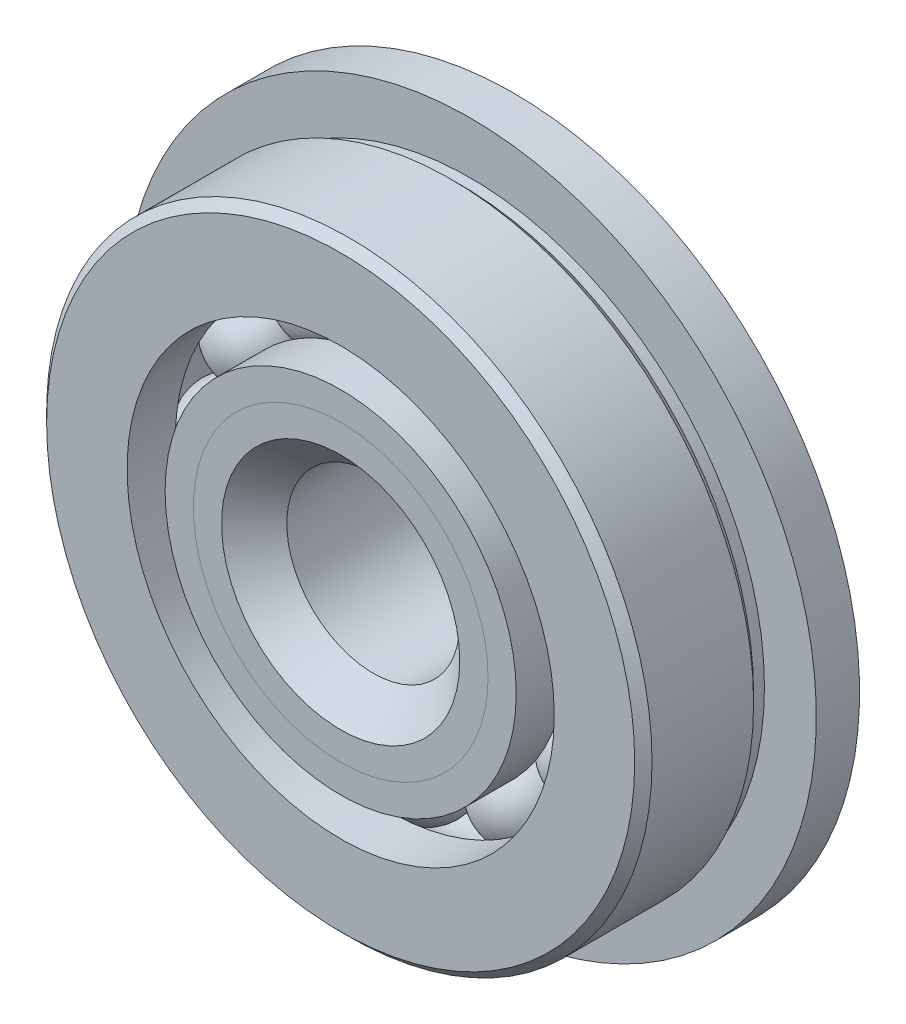
ISO-10303-21;
HEADER;
FILE_DESCRIPTION(('STEP AP214'),'2;1');
FILE_NAME('part.step','',(''),(''),'','','');
FILE_SCHEMA(('AUTOMOTIVE_DESIGN { 1 0 10303 214 1 1 1 1 }'));
ENDSEC;
DATA;
#1=APPLICATION_CONTEXT('core data for automotive mechanical design processes');
#2=APPLICATION_PROTOCOL_DEFINITION('international standard','automotive_design',2000,#1);
#3=PRODUCT_CONTEXT('',#1,'mechanical');
#4=PRODUCT('Part','Part','',(#3));
#5=PRODUCT_RELATED_PRODUCT_CATEGORY('part','',(#4));
#6=PRODUCT_DEFINITION_FORMATION('','',#4);
#7=PRODUCT_DEFINITION_CONTEXT('part definition',#1,'design');
#8=PRODUCT_DEFINITION('design','',#6,#7);
#9=PRODUCT_DEFINITION_SHAPE('','',#8);
#10=(LENGTH_UNIT() NAMED_UNIT(*) SI_UNIT(.MILLI.,.METRE.));
#11=(NAMED_UNIT(*) PLANE_ANGLE_UNIT() SI_UNIT($,.RADIAN.));
#12=(NAMED_UNIT(*) SI_UNIT($,.STERADIAN.) SOLID_ANGLE_UNIT());
#13=UNCERTAINTY_MEASURE_WITH_UNIT(LENGTH_MEASURE(1.E-05),#10,'distance_accuracy_value','');
#14=(GEOMETRIC_REPRESENTATION_CONTEXT(3) GLOBAL_UNCERTAINTY_ASSIGNED_CONTEXT((#13)) GLOBAL_UNIT_ASSIGNED_CONTEXT((#10,
#11,#12)) REPRESENTATION_CONTEXT('',''));
#15=CARTESIAN_POINT('',(0.,0.,0.));
#16=DIRECTION('',(0.,0.,1.));
#17=DIRECTION('',(1.,0.,0.));
#18=AXIS2_PLACEMENT_3D('',#15,#16,#17);
#19=CARTESIAN_POINT('',(-3.57187499999992,6.18666897828513,0.));
#20=DIRECTION('',(0.,0.,1.));
#21=DIRECTION('',(-0.499999999999989,0.866025403784445,0.));
#22=AXIS2_PLACEMENT_3D('',#19,#20,#21);
#23=SPHERICAL_SURFACE('',#22,1.57421805197336);
#24=CARTESIAN_POINT('',(-3.57187499999992,6.18666897828513,1.57421805197336));
#25=VERTEX_POINT('',#24);
#26=VERTEX_LOOP('',#25);
#27=FACE_BOUND('',#26,.T.);
#28=ADVANCED_FACE('F36',(#27),#23,.T.);
#29=CLOSED_SHELL('',(#28));
#30=MANIFOLD_SOLID_BREP('B2',#29);
#31=CARTESIAN_POINT('',(-6.18666897828504,3.57187500000007,0.));
#32=DIRECTION('',(0.,0.,1.));
#33=DIRECTION('',(-0.866025403784433,0.50000000000001,0.));
#34=AXIS2_PLACEMENT_3D('',#31,#32,#33);
#35=SPHERICAL_SURFACE('',#34,1.57421805197336);
#36=CARTESIAN_POINT('',(-6.18666897828504,3.57187500000007,1.57421805197336));
#37=VERTEX_POINT('',#36);
#38=VERTEX_LOOP('',#37);
#39=FACE_BOUND('',#38,.T.);
#40=ADVANCED_FACE('F65',(#39),#35,.T.);
#41=CLOSED_SHELL('',(#40));
#42=MANIFOLD_SOLID_BREP('B6',#41);
#43=CARTESIAN_POINT('',(-7.14375,0.,0.));
#44=DIRECTION('',(0.,0.,1.));
#45=DIRECTION('',(-1.,0.,0.));
#46=AXIS2_PLACEMENT_3D('',#43,#44,#45);
#47=SPHERICAL_SURFACE('',#46,1.57421805197336);
#48=CARTESIAN_POINT('',(-7.14375,0.,1.57421805197336));
#49=VERTEX_POINT('',#48);
#50=VERTEX_LOOP('',#49);
#51=FACE_BOUND('',#50,.T.);
#52=ADVANCED_FACE('F94',(#51),#47,.T.);
#53=CLOSED_SHELL('',(#52));
#54=MANIFOLD_SOLID_BREP('B32',#53);
#55=CARTESIAN_POINT('',(-6.18666897828512,-3.57187499999994,0.));
#56=DIRECTION('',(0.,0.,1.));
#57=DIRECTION('',(-0.866025403784443,-0.499999999999992,0.));
#58=AXIS2_PLACEMENT_3D('',#55,#56,#57);
#59=SPHERICAL_SURFACE('',#58,1.57421805197336);
#60=CARTESIAN_POINT('',(-6.18666897828512,-3.57187499999994,1.57421805197336));
#61=VERTEX_POINT('',#60);
#62=VERTEX_LOOP('',#61);
#63=FACE_BOUND('',#62,.T.);
#64=ADVANCED_FACE('F123',(#63),#59,.T.);
#65=CLOSED_SHELL('',(#64));
#66=MANIFOLD_SOLID_BREP('B61',#65);
#67=CARTESIAN_POINT('',(-3.57187500000005,-6.18666897828506,0.));
#68=DIRECTION('',(0.,0.,1.));
#69=DIRECTION('',(-0.500000000000007,-0.866025403784435,0.));
#70=AXIS2_PLACEMENT_3D('',#67,#68,#69);
#71=SPHERICAL_SURFACE('',#70,1.57421805197336);
#72=CARTESIAN_POINT('',(-3.57187500000005,-6.18666897828506,1.57421805197336));
#73=VERTEX_POINT('',#72);
#74=VERTEX_LOOP('',#73);
#75=FACE_BOUND('',#74,.T.);
#76=ADVANCED_FACE('F152',(#75),#71,.T.);
#77=CLOSED_SHELL('',(#76));
#78=MANIFOLD_SOLID_BREP('B90',#77);
#79=CARTESIAN_POINT('',(0.,-7.14375,0.));
#80=DIRECTION('',(0.,0.,1.));
#81=DIRECTION('',(0.,-1.,0.));
#82=AXIS2_PLACEMENT_3D('',#79,#80,#81);
#83=SPHERICAL_SURFACE('',#82,1.57421805197336);
#84=CARTESIAN_POINT('',(0.,-7.14375,1.57421805197336));
#85=VERTEX_POINT('',#84);
#86=VERTEX_LOOP('',#85);
#87=FACE_BOUND('',#86,.T.);
#88=ADVANCED_FACE('F181',(#87),#83,.T.);
#89=CLOSED_SHELL('',(#88));
#90=MANIFOLD_SOLID_BREP('B119',#89);
#91=CARTESIAN_POINT('',(3.57187499999996,-6.18666897828511,0.));
#92=DIRECTION('',(0.,0.,1.));
#93=DIRECTION('',(0.499999999999995,-0.866025403784442,0.));
#94=AXIS2_PLACEMENT_3D('',#91,#92,#93);
#95=SPHERICAL_SURFACE('',#94,1.57421805197336);
#96=CARTESIAN_POINT('',(3.57187499999996,-6.18666897828511,1.57421805197336));
#97=VERTEX_POINT('',#96);
#98=VERTEX_LOOP('',#97);
#99=FACE_BOUND('',#98,.T.);
#100=ADVANCED_FACE('F210',(#99),#95,.T.);
#101=CLOSED_SHELL('',(#100));
#102=MANIFOLD_SOLID_BREP('B148',#101);
#103=CARTESIAN_POINT('',(6.18666897828507,-3.57187500000003,0.));
#104=DIRECTION('',(0.,0.,1.));
#105=DIRECTION('',(0.866025403784436,-0.500000000000004,0.));
#106=AXIS2_PLACEMENT_3D('',#103,#104,#105);
#107=SPHERICAL_SURFACE('',#106,1.57421805197336);
#108=CARTESIAN_POINT('',(6.18666897828507,-3.57187500000003,1.57421805197336));
#109=VERTEX_POINT('',#108);
#110=VERTEX_LOOP('',#109);
#111=FACE_BOUND('',#110,.T.);
#112=ADVANCED_FACE('F239',(#111),#107,.T.);
#113=CLOSED_SHELL('',(#112));
#114=MANIFOLD_SOLID_BREP('B177',#113);
#115=CARTESIAN_POINT('',(7.14375,0.,0.));
#116=DIRECTION('',(0.,0.,1.));
#117=DIRECTION('',(1.,0.,0.));
#118=AXIS2_PLACEMENT_3D('',#115,#116,#117);
#119=SPHERICAL_SURFACE('',#118,1.57421805197336);
#120=CARTESIAN_POINT('',(7.14375,0.,1.57421805197336));
#121=VERTEX_POINT('',#120);
#122=VERTEX_LOOP('',#121);
#123=FACE_BOUND('',#122,.T.);
#124=ADVANCED_FACE('F268',(#123),#119,.T.);
#125=CLOSED_SHELL('',(#124));
#126=MANIFOLD_SOLID_BREP('B206',#125);
#127=CARTESIAN_POINT('',(6.18666897828509,3.57187499999999,0.));
#128=DIRECTION('',(0.,0.,1.));
#129=DIRECTION('',(0.86602540378444,0.499999999999998,0.));
#130=AXIS2_PLACEMENT_3D('',#127,#128,#129);
#131=SPHERICAL_SURFACE('',#130,1.57421805197336);
#132=CARTESIAN_POINT('',(6.18666897828509,3.57187499999999,1.57421805197336));
#133=VERTEX_POINT('',#132);
#134=VERTEX_LOOP('',#133);
#135=FACE_BOUND('',#134,.T.);
#136=ADVANCED_FACE('F297',(#135),#131,.T.);
#137=CLOSED_SHELL('',(#136));
#138=MANIFOLD_SOLID_BREP('B235',#137);
#139=CARTESIAN_POINT('',(3.57187500000001,6.18666897828508,0.));
#140=DIRECTION('',(0.,0.,1.));
#141=DIRECTION('',(0.500000000000001,0.866025403784438,0.));
#142=AXIS2_PLACEMENT_3D('',#139,#140,#141);
#143=SPHERICAL_SURFACE('',#142,1.57421805197336);
#144=CARTESIAN_POINT('',(3.57187500000001,6.18666897828508,1.57421805197336));
#145=VERTEX_POINT('',#144);
#146=VERTEX_LOOP('',#145);
#147=FACE_BOUND('',#146,.T.);
#148=ADVANCED_FACE('F326',(#147),#143,.T.);
#149=CLOSED_SHELL('',(#148));
#150=MANIFOLD_SOLID_BREP('B264',#149);
#151=CARTESIAN_POINT('',(0.,7.14375,0.));
#152=DIRECTION('',(0.,0.,1.));
#153=DIRECTION('',(0.,1.,0.));
#154=AXIS2_PLACEMENT_3D('',#151,#152,#153);
#155=SPHERICAL_SURFACE('',#154,1.57421805197336);
#156=CARTESIAN_POINT('',(0.,7.14375,1.57421805197336));
#157=VERTEX_POINT('',#156);
#158=VERTEX_LOOP('',#157);
#159=FACE_BOUND('',#158,.T.);
#160=ADVANCED_FACE('F357',(#159),#155,.T.);
#161=CLOSED_SHELL('',(#160));
#162=MANIFOLD_SOLID_BREP('B293',#161);
#163=CARTESIAN_POINT('',(0.,5.40910688810556,3.175));
#164=DIRECTION('',(0.,0.,-1.));
#165=DIRECTION('',(-1.,0.,0.));
#166=AXIS2_PLACEMENT_3D('',#163,#164,#165);
#167=PLANE('',#166);
#168=CARTESIAN_POINT('',(0.,0.,3.175));
#169=DIRECTION('',(0.,0.,1.));
#170=DIRECTION('',(1.,0.,0.));
#171=AXIS2_PLACEMENT_3D('',#168,#169,#170);
#172=CIRCLE('',#171,4.37226597401332);
#173=CARTESIAN_POINT('',(4.37226597401332,0.,3.175));
#174=VERTEX_POINT('',#173);
#175=EDGE_CURVE('E412',#174,#174,#172,.T.);
#176=ORIENTED_EDGE('',*,*,#175,.F.);
#177=EDGE_LOOP('',(#176));
#178=FACE_BOUND('',#177,.T.);
#179=CARTESIAN_POINT('',(0.,0.,3.175));
#180=DIRECTION('',(0.,0.,1.));
#181=DIRECTION('',(1.,0.,0.));
#182=AXIS2_PLACEMENT_3D('',#179,#180,#181);
#183=CIRCLE('',#182,5.40910688810556);
#184=CARTESIAN_POINT('',(5.40910688810556,0.,3.175));
#185=VERTEX_POINT('',#184);
#186=EDGE_CURVE('E356',#185,#185,#183,.T.);
#187=ORIENTED_EDGE('',*,*,#186,.T.);
#188=EDGE_LOOP('',(#187));
#189=FACE_BOUND('',#188,.T.);
#190=ADVANCED_FACE('F378',(#178,#189),#167,.F.);
#191=CARTESIAN_POINT('',(0.,0.,2.13815908590776));
#192=DIRECTION('',(0.,0.,1.));
#193=DIRECTION('',(1.,0.,0.));
#194=AXIS2_PLACEMENT_3D('',#191,#192,#193);
#195=CONICAL_SURFACE('',#194,4.37226597401332,0.78539816339745);
#196=ORIENTED_EDGE('',*,*,#186,.F.);
#197=EDGE_LOOP('',(#196));
#198=FACE_BOUND('',#197,.T.);
#199=CARTESIAN_POINT('',(0.,0.,2.13815908590776));
#200=DIRECTION('',(0.,0.,1.));
#201=DIRECTION('',(1.,0.,0.));
#202=AXIS2_PLACEMENT_3D('',#199,#200,#201);
#203=CIRCLE('',#202,4.37226597401332);
#204=CARTESIAN_POINT('',(4.37226597401332,0.,2.13815908590776));
#205=VERTEX_POINT('',#204);
#206=EDGE_CURVE('E384',#205,#205,#203,.T.);
#207=ORIENTED_EDGE('',*,*,#206,.T.);
#208=EDGE_LOOP('',(#207));
#209=FACE_BOUND('',#208,.T.);
#210=ADVANCED_FACE('F419',(#198,#209),#195,.T.);
#211=CARTESIAN_POINT('',(0.,0.,3.175));
#212=DIRECTION('',(0.,0.,1.));
#213=DIRECTION('',(1.,0.,0.));
#214=AXIS2_PLACEMENT_3D('',#211,#212,#213);
#215=CYLINDRICAL_SURFACE('',#214,4.37226597401332);
#216=ORIENTED_EDGE('',*,*,#206,.F.);
#217=EDGE_LOOP('',(#216));
#218=FACE_BOUND('',#217,.T.);
#219=CARTESIAN_POINT('',(0.,0.,0.));
#220=DIRECTION('',(0.,0.,1.));
#221=DIRECTION('',(1.,0.,0.));
#222=AXIS2_PLACEMENT_3D('',#219,#220,#221);
#223=CIRCLE('',#222,4.37226597401332);
#224=CARTESIAN_POINT('',(4.37226597401332,0.,0.));
#225=VERTEX_POINT('',#224);
#226=EDGE_CURVE('E388',#225,#225,#223,.T.);
#227=ORIENTED_EDGE('',*,*,#226,.T.);
#228=EDGE_LOOP('',(#227));
#229=FACE_BOUND('',#228,.T.);
#230=ADVANCED_FACE('F423',(#218,#229),#215,.T.);
#231=CARTESIAN_POINT('',(0.,4.37226597401332,0.));
#232=DIRECTION('',(0.,0.,-1.));
#233=DIRECTION('',(-1.,0.,0.));
#234=AXIS2_PLACEMENT_3D('',#231,#232,#233);
#235=PLANE('',#234);
#236=ORIENTED_EDGE('',*,*,#226,.F.);
#237=EDGE_LOOP('',(#236));
#238=FACE_BOUND('',#237,.T.);
#239=CARTESIAN_POINT('',(0.,0.,0.));
#240=DIRECTION('',(0.,0.,1.));
#241=DIRECTION('',(1.,0.,0.));
#242=AXIS2_PLACEMENT_3D('',#239,#240,#241);
#243=CIRCLE('',#242,5.56953194802664);
#244=CARTESIAN_POINT('',(5.56953194802664,0.,0.));
#245=VERTEX_POINT('',#244);
#246=EDGE_CURVE('E392',#245,#245,#243,.T.);
#247=ORIENTED_EDGE('',*,*,#246,.T.);
#248=EDGE_LOOP('',(#247));
#249=FACE_BOUND('',#248,.T.);
#250=ADVANCED_FACE('F428',(#238,#249),#235,.F.);
#251=CARTESIAN_POINT('',(0.,0.,0.));
#252=DIRECTION('',(0.,0.,1.));
#253=DIRECTION('',(1.,0.,0.));
#254=AXIS2_PLACEMENT_3D('',#251,#252,#253);
#255=TOROIDAL_SURFACE('',#254,7.14375,1.57421805197336);
#256=ORIENTED_EDGE('',*,*,#246,.F.);
#257=EDGE_LOOP('',(#256));
#258=FACE_BOUND('',#257,.T.);
#259=CARTESIAN_POINT('',(0.,0.,-1.41111111111111));
#260=DIRECTION('',(0.,0.,1.));
#261=DIRECTION('',(1.,0.,0.));
#262=AXIS2_PLACEMENT_3D('',#259,#260,#261);
#263=CIRCLE('',#262,6.4459478021978);
#264=CARTESIAN_POINT('',(6.4459478021978,0.,-1.41111111111111));
#265=VERTEX_POINT('',#264);
#266=EDGE_CURVE('E397',#265,#265,#263,.T.);
#267=ORIENTED_EDGE('',*,*,#266,.T.);
#268=EDGE_LOOP('',(#267));
#269=FACE_BOUND('',#268,.T.);
#270=ADVANCED_FACE('F434',(#258,#269),#255,.F.);
#271=CARTESIAN_POINT('',(0.,0.,3.175));
#272=DIRECTION('',(0.,0.,1.));
#273=DIRECTION('',(1.,0.,0.));
#274=AXIS2_PLACEMENT_3D('',#271,#272,#273);
#275=CYLINDRICAL_SURFACE('',#274,6.4459478021978);
#276=ORIENTED_EDGE('',*,*,#266,.F.);
#277=EDGE_LOOP('',(#276));
#278=FACE_BOUND('',#277,.T.);
#279=CARTESIAN_POINT('',(0.,0.,-4.7625));
#280=DIRECTION('',(0.,0.,1.));
#281=DIRECTION('',(1.,0.,0.));
#282=AXIS2_PLACEMENT_3D('',#279,#280,#281);
#283=CIRCLE('',#282,6.4459478021978);
#284=CARTESIAN_POINT('',(6.4459478021978,0.,-4.7625));
#285=VERTEX_POINT('',#284);
#286=EDGE_CURVE('E400',#285,#285,#283,.T.);
#287=ORIENTED_EDGE('',*,*,#286,.T.);
#288=EDGE_LOOP('',(#287));
#289=FACE_BOUND('',#288,.T.);
#290=ADVANCED_FACE('F438',(#278,#289),#275,.T.);
#291=CARTESIAN_POINT('',(0.,3.4925,-4.7625));
#292=DIRECTION('',(0.,0.,1.));
#293=DIRECTION('',(1.,0.,0.));
#294=AXIS2_PLACEMENT_3D('',#291,#292,#293);
#295=PLANE('',#294);
#296=ORIENTED_EDGE('',*,*,#286,.F.);
#297=EDGE_LOOP('',(#296));
#298=FACE_BOUND('',#297,.T.);
#299=CARTESIAN_POINT('',(0.,0.,-4.7625));
#300=DIRECTION('',(0.,0.,1.));
#301=DIRECTION('',(1.,0.,0.));
#302=AXIS2_PLACEMENT_3D('',#299,#300,#301);
#303=CIRCLE('',#302,3.4925);
#304=CARTESIAN_POINT('',(3.4925,0.,-4.7625));
#305=VERTEX_POINT('',#304);
#306=EDGE_CURVE('E403',#305,#305,#303,.T.);
#307=ORIENTED_EDGE('',*,*,#306,.T.);
#308=EDGE_LOOP('',(#307));
#309=FACE_BOUND('',#308,.T.);
#310=ADVANCED_FACE('F442',(#298,#309),#295,.F.);
#311=CARTESIAN_POINT('',(0.,0.,-4.445));
#312=DIRECTION('',(0.,0.,-1.));
#313=DIRECTION('',(-1.,0.,0.));
#314=AXIS2_PLACEMENT_3D('',#311,#312,#313);
#315=CONICAL_SURFACE('',#314,3.175,0.785398163397444);
#316=ORIENTED_EDGE('',*,*,#306,.F.);
#317=EDGE_LOOP('',(#316));
#318=FACE_BOUND('',#317,.T.);
#319=CARTESIAN_POINT('',(0.,0.,-4.445));
#320=DIRECTION('',(0.,0.,1.));
#321=DIRECTION('',(1.,0.,0.));
#322=AXIS2_PLACEMENT_3D('',#319,#320,#321);
#323=CIRCLE('',#322,3.175);
#324=CARTESIAN_POINT('',(3.175,0.,-4.445));
#325=VERTEX_POINT('',#324);
#326=EDGE_CURVE('E406',#325,#325,#323,.T.);
#327=ORIENTED_EDGE('',*,*,#326,.T.);
#328=EDGE_LOOP('',(#327));
#329=FACE_BOUND('',#328,.T.);
#330=ADVANCED_FACE('F446',(#318,#329),#315,.F.);
#331=CARTESIAN_POINT('',(0.,0.,3.175));
#332=DIRECTION('',(0.,0.,1.));
#333=DIRECTION('',(1.,0.,0.));
#334=AXIS2_PLACEMENT_3D('',#331,#332,#333);
#335=CYLINDRICAL_SURFACE('',#334,3.175);
#336=ORIENTED_EDGE('',*,*,#326,.F.);
#337=EDGE_LOOP('',(#336));
#338=FACE_BOUND('',#337,.T.);
#339=CARTESIAN_POINT('',(0.,0.,1.97773402598668));
#340=DIRECTION('',(0.,0.,1.));
#341=DIRECTION('',(1.,0.,0.));
#342=AXIS2_PLACEMENT_3D('',#339,#340,#341);
#343=CIRCLE('',#342,3.175);
#344=CARTESIAN_POINT('',(3.175,0.,1.97773402598668));
#345=VERTEX_POINT('',#344);
#346=EDGE_CURVE('E409',#345,#345,#343,.T.);
#347=ORIENTED_EDGE('',*,*,#346,.T.);
#348=EDGE_LOOP('',(#347));
#349=FACE_BOUND('',#348,.T.);
#350=ADVANCED_FACE('F450',(#338,#349),#335,.F.);
#351=CARTESIAN_POINT('',(0.,0.,3.175));
#352=DIRECTION('',(0.,0.,1.));
#353=DIRECTION('',(1.,0.,0.));
#354=AXIS2_PLACEMENT_3D('',#351,#352,#353);
#355=CONICAL_SURFACE('',#354,4.37226597401332,0.785398163397448);
#356=ORIENTED_EDGE('',*,*,#346,.F.);
#357=EDGE_LOOP('',(#356));
#358=FACE_BOUND('',#357,.T.);
#359=ORIENTED_EDGE('',*,*,#175,.T.);
#360=EDGE_LOOP('',(#359));
#361=FACE_BOUND('',#360,.T.);
#362=ADVANCED_FACE('F416',(#358,#361),#355,.F.);
#363=CLOSED_SHELL('',(#190,#210,#230,#250,#270,#290,#310,#330,#350,#362));
#364=MANIFOLD_SOLID_BREP('B322',#363);
#365=CARTESIAN_POINT('',(0.,6.44594780219781,3.175));
#366=DIRECTION('',(0.,0.,-1.));
#367=DIRECTION('',(-1.,0.,0.));
#368=AXIS2_PLACEMENT_3D('',#365,#366,#367);
#369=PLANE('',#368);
#370=CARTESIAN_POINT('',(0.,0.,3.175));
#371=DIRECTION('',(0.,0.,1.));
#372=DIRECTION('',(1.,0.,0.));
#373=AXIS2_PLACEMENT_3D('',#370,#371,#372);
#374=CIRCLE('',#373,5.40910688810556);
#375=CARTESIAN_POINT('',(5.40910688810556,0.,3.175));
#376=VERTEX_POINT('',#375);
#377=EDGE_CURVE('E377',#376,#376,#374,.T.);
#378=ORIENTED_EDGE('',*,*,#377,.F.);
#379=EDGE_LOOP('',(#378));
#380=FACE_BOUND('',#379,.T.);
#381=CARTESIAN_POINT('',(0.,0.,3.175));
#382=DIRECTION('',(0.,0.,1.));
#383=DIRECTION('',(1.,0.,0.));
#384=AXIS2_PLACEMENT_3D('',#381,#382,#383);
#385=CIRCLE('',#384,6.44594780219781);
#386=CARTESIAN_POINT('',(6.44594780219781,0.,3.175));
#387=VERTEX_POINT('',#386);
#388=EDGE_CURVE('E559',#387,#387,#385,.T.);
#389=ORIENTED_EDGE('',*,*,#388,.T.);
#390=EDGE_LOOP('',(#389));
#391=FACE_BOUND('',#390,.T.);
#392=ADVANCED_FACE('F537',(#380,#391),#369,.F.);
#393=CARTESIAN_POINT('',(0.,0.,3.175));
#394=DIRECTION('',(0.,0.,1.));
#395=DIRECTION('',(1.,0.,0.));
#396=AXIS2_PLACEMENT_3D('',#393,#394,#395);
#397=CONICAL_SURFACE('',#396,5.40910688810556,0.78539816339745);
#398=CARTESIAN_POINT('',(0.,0.,2.13815908590776));
#399=DIRECTION('',(0.,0.,1.));
#400=DIRECTION('',(1.,0.,0.));
#401=AXIS2_PLACEMENT_3D('',#398,#399,#400);
#402=CIRCLE('',#401,4.37226597401332);
#403=CARTESIAN_POINT('',(4.37226597401332,0.,2.13815908590776));
#404=VERTEX_POINT('',#403);
#405=EDGE_CURVE('E543',#404,#404,#402,.T.);
#406=ORIENTED_EDGE('',*,*,#405,.F.);
#407=EDGE_LOOP('',(#406));
#408=FACE_BOUND('',#407,.T.);
#409=ORIENTED_EDGE('',*,*,#377,.T.);
#410=EDGE_LOOP('',(#409));
#411=FACE_BOUND('',#410,.T.);
#412=ADVANCED_FACE('F584',(#408,#411),#397,.F.);
#413=CARTESIAN_POINT('',(0.,0.,3.175));
#414=DIRECTION('',(0.,0.,1.));
#415=DIRECTION('',(1.,0.,0.));
#416=AXIS2_PLACEMENT_3D('',#413,#414,#415);
#417=CYLINDRICAL_SURFACE('',#416,4.37226597401332);
#418=CARTESIAN_POINT('',(0.,0.,0.));
#419=DIRECTION('',(0.,0.,1.));
#420=DIRECTION('',(1.,0.,0.));
#421=AXIS2_PLACEMENT_3D('',#418,#419,#420);
#422=CIRCLE('',#421,4.37226597401332);
#423=CARTESIAN_POINT('',(4.37226597401332,0.,0.));
#424=VERTEX_POINT('',#423);
#425=EDGE_CURVE('E547',#424,#424,#422,.T.);
#426=ORIENTED_EDGE('',*,*,#425,.F.);
#427=EDGE_LOOP('',(#426));
#428=FACE_BOUND('',#427,.T.);
#429=ORIENTED_EDGE('',*,*,#405,.T.);
#430=EDGE_LOOP('',(#429));
#431=FACE_BOUND('',#430,.T.);
#432=ADVANCED_FACE('F579',(#428,#431),#417,.F.);
#433=CARTESIAN_POINT('',(0.,4.37226597401332,0.));
#434=DIRECTION('',(0.,0.,1.));
#435=DIRECTION('',(1.,0.,0.));
#436=AXIS2_PLACEMENT_3D('',#433,#434,#435);
#437=PLANE('',#436);
#438=CARTESIAN_POINT('',(0.,0.,0.));
#439=DIRECTION('',(0.,0.,1.));
#440=DIRECTION('',(1.,0.,0.));
#441=AXIS2_PLACEMENT_3D('',#438,#439,#440);
#442=CIRCLE('',#441,5.56953194802664);
#443=CARTESIAN_POINT('',(5.56953194802664,0.,0.));
#444=VERTEX_POINT('',#443);
#445=EDGE_CURVE('E551',#444,#444,#442,.T.);
#446=ORIENTED_EDGE('',*,*,#445,.F.);
#447=EDGE_LOOP('',(#446));
#448=FACE_BOUND('',#447,.T.);
#449=ORIENTED_EDGE('',*,*,#425,.T.);
#450=EDGE_LOOP('',(#449));
#451=FACE_BOUND('',#450,.T.);
#452=ADVANCED_FACE('F573',(#448,#451),#437,.F.);
#453=CARTESIAN_POINT('',(0.,0.,0.));
#454=DIRECTION('',(0.,0.,1.));
#455=DIRECTION('',(1.,0.,0.));
#456=AXIS2_PLACEMENT_3D('',#453,#454,#455);
#457=TOROIDAL_SURFACE('',#456,7.14375,1.57421805197336);
#458=CARTESIAN_POINT('',(0.,0.,1.41111111111111));
#459=DIRECTION('',(0.,0.,1.));
#460=DIRECTION('',(1.,0.,0.));
#461=AXIS2_PLACEMENT_3D('',#458,#459,#460);
#462=CIRCLE('',#461,6.44594780219781);
#463=CARTESIAN_POINT('',(6.44594780219781,0.,1.41111111111111));
#464=VERTEX_POINT('',#463);
#465=EDGE_CURVE('E556',#464,#464,#462,.T.);
#466=ORIENTED_EDGE('',*,*,#465,.F.);
#467=EDGE_LOOP('',(#466));
#468=FACE_BOUND('',#467,.T.);
#469=ORIENTED_EDGE('',*,*,#445,.T.);
#470=EDGE_LOOP('',(#469));
#471=FACE_BOUND('',#470,.T.);
#472=ADVANCED_FACE('F567',(#468,#471),#457,.F.);
#473=CARTESIAN_POINT('',(0.,0.,3.175));
#474=DIRECTION('',(0.,0.,1.));
#475=DIRECTION('',(1.,0.,0.));
#476=AXIS2_PLACEMENT_3D('',#473,#474,#475);
#477=CYLINDRICAL_SURFACE('',#476,6.44594780219781);
#478=ORIENTED_EDGE('',*,*,#388,.F.);
#479=EDGE_LOOP('',(#478));
#480=FACE_BOUND('',#479,.T.);
#481=ORIENTED_EDGE('',*,*,#465,.T.);
#482=EDGE_LOOP('',(#481));
#483=FACE_BOUND('',#482,.T.);
#484=ADVANCED_FACE('F564',(#480,#483),#477,.T.);
#485=CLOSED_SHELL('',(#392,#412,#432,#452,#472,#484));
#486=MANIFOLD_SOLID_BREP('B351',#485);
#487=CARTESIAN_POINT('',(0.,0.,3.175));
#488=DIRECTION('',(0.,0.,1.));
#489=DIRECTION('',(1.,0.,0.));
#490=AXIS2_PLACEMENT_3D('',#487,#488,#489);
#491=CYLINDRICAL_SURFACE('',#490,11.1125);
#492=CARTESIAN_POINT('',(0.,0.,2.8575));
#493=DIRECTION('',(0.,0.,1.));
#494=DIRECTION('',(1.,0.,0.));
#495=AXIS2_PLACEMENT_3D('',#492,#493,#494);
#496=CIRCLE('',#495,11.1125);
#497=CARTESIAN_POINT('',(11.1125,0.,2.8575));
#498=VERTEX_POINT('',#497);
#499=EDGE_CURVE('E536',#498,#498,#496,.T.);
#500=ORIENTED_EDGE('',*,*,#499,.F.);
#501=EDGE_LOOP('',(#500));
#502=FACE_BOUND('',#501,.T.);
#503=CARTESIAN_POINT('',(0.,0.,-0.873125000000001));
#504=DIRECTION('',(0.,0.,1.));
#505=DIRECTION('',(1.,0.,0.));
#506=AXIS2_PLACEMENT_3D('',#503,#504,#505);
#507=CIRCLE('',#506,11.1125);
#508=CARTESIAN_POINT('',(11.1125,0.,-0.873125000000001));
#509=VERTEX_POINT('',#508);
#510=EDGE_CURVE('E667',#509,#509,#507,.T.);
#511=ORIENTED_EDGE('',*,*,#510,.T.);
#512=EDGE_LOOP('',(#511));
#513=FACE_BOUND('',#512,.T.);
#514=ADVANCED_FACE('F629',(#502,#513),#491,.T.);
#515=CARTESIAN_POINT('',(0.,0.,2.8575));
#516=DIRECTION('',(0.,0.,-1.));
#517=DIRECTION('',(-1.,0.,0.));
#518=AXIS2_PLACEMENT_3D('',#515,#516,#517);
#519=CONICAL_SURFACE('',#518,11.1125,0.785398163397446);
#520=CARTESIAN_POINT('',(0.,0.,3.175));
#521=DIRECTION('',(0.,0.,1.));
#522=DIRECTION('',(1.,0.,0.));
#523=AXIS2_PLACEMENT_3D('',#520,#521,#522);
#524=CIRCLE('',#523,10.795);
#525=CARTESIAN_POINT('',(10.795,0.,3.175));
#526=VERTEX_POINT('',#525);
#527=EDGE_CURVE('E652',#526,#526,#524,.T.);
#528=ORIENTED_EDGE('',*,*,#527,.F.);
#529=EDGE_LOOP('',(#528));
#530=FACE_BOUND('',#529,.T.);
#531=ORIENTED_EDGE('',*,*,#499,.T.);
#532=EDGE_LOOP('',(#531));
#533=FACE_BOUND('',#532,.T.);
#534=ADVANCED_FACE('F631',(#530,#533),#519,.T.);
#535=CARTESIAN_POINT('',(0.,10.795,-3.175));
#536=DIRECTION('',(0.,0.,1.));
#537=DIRECTION('',(1.,0.,0.));
#538=AXIS2_PLACEMENT_3D('',#535,#536,#537);
#539=PLANE('',#538);
#540=CARTESIAN_POINT('',(0.,0.,-3.175));
#541=DIRECTION('',(0.,0.,1.));
#542=DIRECTION('',(1.,0.,0.));
#543=AXIS2_PLACEMENT_3D('',#540,#541,#542);
#544=CIRCLE('',#543,7.8415521978022);
#545=CARTESIAN_POINT('',(7.8415521978022,0.,-3.175));
#546=VERTEX_POINT('',#545);
#547=EDGE_CURVE('E636',#546,#546,#544,.T.);
#548=ORIENTED_EDGE('',*,*,#547,.T.);
#549=EDGE_LOOP('',(#548));
#550=FACE_BOUND('',#549,.T.);
#551=CARTESIAN_POINT('',(0.,0.,-3.175));
#552=DIRECTION('',(0.,0.,-1.));
#553=DIRECTION('',(-1.,0.,0.));
#554=AXIS2_PLACEMENT_3D('',#551,#552,#553);
#555=CIRCLE('',#554,12.7);
#556=CARTESIAN_POINT('',(-12.7,0.,-3.175));
#557=VERTEX_POINT('',#556);
#558=EDGE_CURVE('E655',#557,#557,#555,.T.);
#559=ORIENTED_EDGE('',*,*,#558,.T.);
#560=EDGE_LOOP('',(#559));
#561=FACE_BOUND('',#560,.T.);
#562=ADVANCED_FACE('F688',(#550,#561),#539,.F.);
#563=CARTESIAN_POINT('',(0.,0.,3.175));
#564=DIRECTION('',(0.,0.,1.));
#565=DIRECTION('',(1.,0.,0.));
#566=AXIS2_PLACEMENT_3D('',#563,#564,#565);
#567=CYLINDRICAL_SURFACE('',#566,7.8415521978022);
#568=ORIENTED_EDGE('',*,*,#547,.F.);
#569=EDGE_LOOP('',(#568));
#570=FACE_BOUND('',#569,.T.);
#571=CARTESIAN_POINT('',(0.,0.,-1.41111111111111));
#572=DIRECTION('',(0.,0.,1.));
#573=DIRECTION('',(1.,0.,0.));
#574=AXIS2_PLACEMENT_3D('',#571,#572,#573);
#575=CIRCLE('',#574,7.8415521978022);
#576=CARTESIAN_POINT('',(7.8415521978022,0.,-1.41111111111111));
#577=VERTEX_POINT('',#576);
#578=EDGE_CURVE('E640',#577,#577,#575,.T.);
#579=ORIENTED_EDGE('',*,*,#578,.T.);
#580=EDGE_LOOP('',(#579));
#581=FACE_BOUND('',#580,.T.);
#582=ADVANCED_FACE('F693',(#570,#581),#567,.F.);
#583=CARTESIAN_POINT('',(0.,0.,0.));
#584=DIRECTION('',(0.,0.,1.));
#585=DIRECTION('',(1.,0.,0.));
#586=AXIS2_PLACEMENT_3D('',#583,#584,#585);
#587=TOROIDAL_SURFACE('',#586,7.14375,1.57421805197336);
#588=ORIENTED_EDGE('',*,*,#578,.F.);
#589=EDGE_LOOP('',(#588));
#590=FACE_BOUND('',#589,.T.);
#591=CARTESIAN_POINT('',(0.,0.,1.41111111111111));
#592=DIRECTION('',(0.,0.,1.));
#593=DIRECTION('',(1.,0.,0.));
#594=AXIS2_PLACEMENT_3D('',#591,#592,#593);
#595=CIRCLE('',#594,7.8415521978022);
#596=CARTESIAN_POINT('',(7.8415521978022,0.,1.41111111111111));
#597=VERTEX_POINT('',#596);
#598=EDGE_CURVE('E644',#597,#597,#595,.T.);
#599=ORIENTED_EDGE('',*,*,#598,.T.);
#600=EDGE_LOOP('',(#599));
#601=FACE_BOUND('',#600,.T.);
#602=ADVANCED_FACE('F696',(#590,#601),#587,.F.);
#603=CARTESIAN_POINT('',(0.,0.,3.175));
#604=DIRECTION('',(0.,0.,1.));
#605=DIRECTION('',(1.,0.,0.));
#606=AXIS2_PLACEMENT_3D('',#603,#604,#605);
#607=CYLINDRICAL_SURFACE('',#606,7.8415521978022);
#608=ORIENTED_EDGE('',*,*,#598,.F.);
#609=EDGE_LOOP('',(#608));
#610=FACE_BOUND('',#609,.T.);
#611=CARTESIAN_POINT('',(0.,0.,3.175));
#612=DIRECTION('',(0.,0.,1.));
#613=DIRECTION('',(1.,0.,0.));
#614=AXIS2_PLACEMENT_3D('',#611,#612,#613);
#615=CIRCLE('',#614,7.8415521978022);
#616=CARTESIAN_POINT('',(7.8415521978022,0.,3.175));
#617=VERTEX_POINT('',#616);
#618=EDGE_CURVE('E649',#617,#617,#615,.T.);
#619=ORIENTED_EDGE('',*,*,#618,.T.);
#620=EDGE_LOOP('',(#619));
#621=FACE_BOUND('',#620,.T.);
#622=ADVANCED_FACE('F700',(#610,#621),#607,.F.);
#623=CARTESIAN_POINT('',(0.,10.795,3.175));
#624=DIRECTION('',(0.,0.,-1.));
#625=DIRECTION('',(-1.,0.,0.));
#626=AXIS2_PLACEMENT_3D('',#623,#624,#625);
#627=PLANE('',#626);
#628=ORIENTED_EDGE('',*,*,#618,.F.);
#629=EDGE_LOOP('',(#628));
#630=FACE_BOUND('',#629,.T.);
#631=ORIENTED_EDGE('',*,*,#527,.T.);
#632=EDGE_LOOP('',(#631));
#633=FACE_BOUND('',#632,.T.);
#634=ADVANCED_FACE('F704',(#630,#633),#627,.F.);
#635=CARTESIAN_POINT('',(0.,9.3182760989011,-1.5875));
#636=DIRECTION('',(0.,0.,1.));
#637=DIRECTION('',(1.,0.,0.));
#638=AXIS2_PLACEMENT_3D('',#635,#636,#637);
#639=PLANE('',#638);
#640=CARTESIAN_POINT('',(0.,0.,-1.5875));
#641=DIRECTION('',(0.,0.,-1.));
#642=DIRECTION('',(-1.,0.,0.));
#643=AXIS2_PLACEMENT_3D('',#640,#641,#642);
#644=CIRCLE('',#643,12.7);
#645=CARTESIAN_POINT('',(-12.7,0.,-1.5875));
#646=VERTEX_POINT('',#645);
#647=EDGE_CURVE('E658',#646,#646,#644,.T.);
#648=ORIENTED_EDGE('',*,*,#647,.F.);
#649=EDGE_LOOP('',(#648));
#650=FACE_BOUND('',#649,.T.);
#651=CARTESIAN_POINT('',(0.,0.,-1.5875));
#652=DIRECTION('',(0.,0.,1.));
#653=DIRECTION('',(1.,0.,0.));
#654=AXIS2_PLACEMENT_3D('',#651,#652,#653);
#655=CIRCLE('',#654,10.795);
#656=CARTESIAN_POINT('',(10.795,0.,-1.5875));
#657=VERTEX_POINT('',#656);
#658=EDGE_CURVE('E661',#657,#657,#655,.T.);
#659=ORIENTED_EDGE('',*,*,#658,.F.);
#660=EDGE_LOOP('',(#659));
#661=FACE_BOUND('',#660,.T.);
#662=ADVANCED_FACE('F708',(#650,#661),#639,.T.);
#663=CARTESIAN_POINT('',(0.,0.,-4.7625));
#664=DIRECTION('',(0.,0.,-1.));
#665=DIRECTION('',(-1.,0.,0.));
#666=AXIS2_PLACEMENT_3D('',#663,#664,#665);
#667=CYLINDRICAL_SURFACE('',#666,12.7);
#668=ORIENTED_EDGE('',*,*,#647,.T.);
#669=EDGE_LOOP('',(#668));
#670=FACE_BOUND('',#669,.T.);
#671=ORIENTED_EDGE('',*,*,#558,.F.);
#672=EDGE_LOOP('',(#671));
#673=FACE_BOUND('',#672,.T.);
#674=ADVANCED_FACE('F680',(#670,#673),#667,.T.);
#675=CARTESIAN_POINT('',(0.,0.,3.175));
#676=DIRECTION('',(0.,0.,1.));
#677=DIRECTION('',(1.,0.,0.));
#678=AXIS2_PLACEMENT_3D('',#675,#676,#677);
#679=CYLINDRICAL_SURFACE('',#678,10.795);
#680=ORIENTED_EDGE('',*,*,#658,.T.);
#681=EDGE_LOOP('',(#680));
#682=FACE_BOUND('',#681,.T.);
#683=CARTESIAN_POINT('',(0.,0.,-1.190625));
#684=DIRECTION('',(0.,0.,1.));
#685=DIRECTION('',(1.,0.,0.));
#686=AXIS2_PLACEMENT_3D('',#683,#684,#685);
#687=CIRCLE('',#686,10.795);
#688=CARTESIAN_POINT('',(10.795,0.,-1.190625));
#689=VERTEX_POINT('',#688);
#690=EDGE_CURVE('E664',#689,#689,#687,.T.);
#691=ORIENTED_EDGE('',*,*,#690,.F.);
#692=EDGE_LOOP('',(#691));
#693=FACE_BOUND('',#692,.T.);
#694=ADVANCED_FACE('F674',(#682,#693),#679,.T.);
#695=CARTESIAN_POINT('',(0.,0.,-0.873125000000001));
#696=DIRECTION('',(0.,0.,1.));
#697=DIRECTION('',(1.,0.,0.));
#698=AXIS2_PLACEMENT_3D('',#695,#696,#697);
#699=CONICAL_SURFACE('',#698,11.1125,0.785398163397437);
#700=ORIENTED_EDGE('',*,*,#690,.T.);
#701=EDGE_LOOP('',(#700));
#702=FACE_BOUND('',#701,.T.);
#703=ORIENTED_EDGE('',*,*,#510,.F.);
#704=EDGE_LOOP('',(#703));
#705=FACE_BOUND('',#704,.T.);
#706=ADVANCED_FACE('F672',(#702,#705),#699,.T.);
#707=CLOSED_SHELL('',(#514,#534,#562,#582,#602,#622,#634,#662,#674,#694,#706));
#708=MANIFOLD_SOLID_BREP('B372',#707);
#709=ADVANCED_BREP_SHAPE_REPRESENTATION('',(#18,#30,#42,#54,#66,#78,#90,#102,#114,#126,#138,
#150,#162,#364,#486,#708),#14);
#710=SHAPE_DEFINITION_REPRESENTATION(#9,#709);
ENDSEC;
END-ISO-10303-21;
